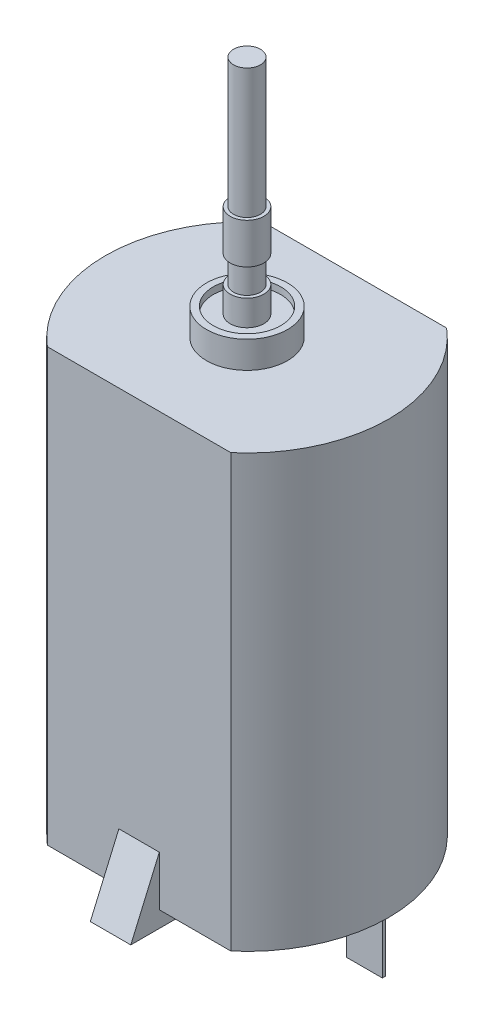
ISO-10303-21;
HEADER;
FILE_DESCRIPTION(('STEP AP214'),'2;1');
FILE_NAME('part.step','',(''),(''),'','','');
FILE_SCHEMA(('AUTOMOTIVE_DESIGN { 1 0 10303 214 1 1 1 1 }'));
ENDSEC;
DATA;
#1=APPLICATION_CONTEXT('core data for automotive mechanical design processes');
#2=APPLICATION_PROTOCOL_DEFINITION('international standard','automotive_design',2000,#1);
#3=PRODUCT_CONTEXT('',#1,'mechanical');
#4=PRODUCT('Part','Part','',(#3));
#5=PRODUCT_RELATED_PRODUCT_CATEGORY('part','',(#4));
#6=PRODUCT_DEFINITION_FORMATION('','',#4);
#7=PRODUCT_DEFINITION_CONTEXT('part definition',#1,'design');
#8=PRODUCT_DEFINITION('design','',#6,#7);
#9=PRODUCT_DEFINITION_SHAPE('','',#8);
#10=(LENGTH_UNIT() NAMED_UNIT(*) SI_UNIT(.MILLI.,.METRE.));
#11=(NAMED_UNIT(*) PLANE_ANGLE_UNIT() SI_UNIT($,.RADIAN.));
#12=(NAMED_UNIT(*) SI_UNIT($,.STERADIAN.) SOLID_ANGLE_UNIT());
#13=UNCERTAINTY_MEASURE_WITH_UNIT(LENGTH_MEASURE(1.E-05),#10,'distance_accuracy_value','');
#14=(GEOMETRIC_REPRESENTATION_CONTEXT(3) GLOBAL_UNCERTAINTY_ASSIGNED_CONTEXT((#13)) GLOBAL_UNIT_ASSIGNED_CONTEXT((#10,
#11,#12)) REPRESENTATION_CONTEXT('',''));
#15=CARTESIAN_POINT('',(0.,0.,0.));
#16=DIRECTION('',(0.,0.,1.));
#17=DIRECTION('',(1.,0.,0.));
#18=AXIS2_PLACEMENT_3D('',#15,#16,#17);
#19=CARTESIAN_POINT('',(1.5,0.,6.55299918127229));
#20=DIRECTION('',(0.,-1.,0.));
#21=DIRECTION('',(0.,0.,-1.));
#22=AXIS2_PLACEMENT_3D('',#19,#20,#21);
#23=PLANE('',#22);
#24=DIRECTION('',(0.,0.,1.));
#25=VECTOR('',#24,1.);
#26=CARTESIAN_POINT('',(-1.5,0.,6.55299918127229));
#27=LINE('',#26,#25);
#28=CARTESIAN_POINT('',(-1.5,0.,6.55299918127229));
#29=VERTEX_POINT('',#28);
#30=CARTESIAN_POINT('',(-1.5,0.,8.));
#31=VERTEX_POINT('',#30);
#32=EDGE_CURVE('E124',#29,#31,#27,.T.);
#33=ORIENTED_EDGE('',*,*,#32,.T.);
#34=DIRECTION('',(-1.,0.,0.));
#35=VECTOR('',#34,1.);
#36=CARTESIAN_POINT('',(1.5,0.,8.));
#37=LINE('',#36,#35);
#38=CARTESIAN_POINT('',(1.5,0.,8.));
#39=VERTEX_POINT('',#38);
#40=EDGE_CURVE('E12',#39,#31,#37,.T.);
#41=ORIENTED_EDGE('',*,*,#40,.F.);
#42=DIRECTION('',(0.,0.,1.));
#43=VECTOR('',#42,1.);
#44=CARTESIAN_POINT('',(1.5,0.,6.55299918127229));
#45=LINE('',#44,#43);
#46=CARTESIAN_POINT('',(1.5,0.,6.55299918127229));
#47=VERTEX_POINT('',#46);
#48=EDGE_CURVE('E132',#47,#39,#45,.T.);
#49=ORIENTED_EDGE('',*,*,#48,.F.);
#50=DIRECTION('',(-1.,0.,0.));
#51=VECTOR('',#50,1.);
#52=CARTESIAN_POINT('',(1.5,0.,6.55299918127229));
#53=LINE('',#52,#51);
#54=EDGE_CURVE('E120',#47,#29,#53,.T.);
#55=ORIENTED_EDGE('',*,*,#54,.T.);
#56=EDGE_LOOP('',(#33,#41,#49,#55));
#57=FACE_BOUND('',#56,.T.);
#58=ADVANCED_FACE('F50',(#57),#23,.F.);
#59=CARTESIAN_POINT('',(1.5,0.,8.));
#60=DIRECTION('',(0.,0.,1.));
#61=DIRECTION('',(1.,0.,0.));
#62=AXIS2_PLACEMENT_3D('',#59,#60,#61);
#63=PLANE('',#62);
#64=DIRECTION('',(0.,1.,0.));
#65=VECTOR('',#64,1.);
#66=CARTESIAN_POINT('',(-1.5,0.,8.));
#67=LINE('',#66,#65);
#68=CARTESIAN_POINT('',(-1.5,3.69723979895403,8.));
#69=VERTEX_POINT('',#68);
#70=EDGE_CURVE('E127',#31,#69,#67,.T.);
#71=ORIENTED_EDGE('',*,*,#70,.T.);
#72=DIRECTION('',(-1.,0.,0.));
#73=VECTOR('',#72,1.);
#74=CARTESIAN_POINT('',(1.5,3.69723979895403,8.));
#75=LINE('',#74,#73);
#76=CARTESIAN_POINT('',(1.5,3.69723979895403,8.));
#77=VERTEX_POINT('',#76);
#78=EDGE_CURVE('E58',#77,#69,#75,.T.);
#79=ORIENTED_EDGE('',*,*,#78,.F.);
#80=DIRECTION('',(0.,1.,0.));
#81=VECTOR('',#80,1.);
#82=CARTESIAN_POINT('',(1.5,0.,8.));
#83=LINE('',#82,#81);
#84=EDGE_CURVE('E100',#39,#77,#83,.T.);
#85=ORIENTED_EDGE('',*,*,#84,.F.);
#86=ORIENTED_EDGE('',*,*,#40,.T.);
#87=EDGE_LOOP('',(#71,#79,#85,#86));
#88=FACE_BOUND('',#87,.T.);
#89=ADVANCED_FACE('F151',(#88),#63,.F.);
#90=CARTESIAN_POINT('',(1.5,3.69723979895403,8.));
#91=DIRECTION('',(0.,-0.396457120748577,-0.918053239963646));
#92=DIRECTION('',(0.,0.918053239963646,-0.396457120748577));
#93=AXIS2_PLACEMENT_3D('',#90,#91,#92);
#94=PLANE('',#93);
#95=DIRECTION('',(0.,-0.918053239963646,0.396457120748577));
#96=VECTOR('',#95,1.);
#97=CARTESIAN_POINT('',(-1.5,3.69723979895403,8.));
#98=LINE('',#97,#96);
#99=CARTESIAN_POINT('',(-1.5,-1.2,10.1148507578771));
#100=VERTEX_POINT('',#99);
#101=EDGE_CURVE('E115',#69,#100,#98,.T.);
#102=ORIENTED_EDGE('',*,*,#101,.T.);
#103=DIRECTION('',(-1.,0.,0.));
#104=VECTOR('',#103,1.);
#105=CARTESIAN_POINT('',(1.5,-1.2,10.1148507578771));
#106=LINE('',#105,#104);
#107=CARTESIAN_POINT('',(1.5,-1.2,10.1148507578771));
#108=VERTEX_POINT('',#107);
#109=EDGE_CURVE('E112',#108,#100,#106,.T.);
#110=ORIENTED_EDGE('',*,*,#109,.F.);
#111=DIRECTION('',(0.,-0.918053239963646,0.396457120748577));
#112=VECTOR('',#111,1.);
#113=CARTESIAN_POINT('',(1.5,3.69723979895403,8.));
#114=LINE('',#113,#112);
#115=EDGE_CURVE('E104',#77,#108,#114,.T.);
#116=ORIENTED_EDGE('',*,*,#115,.F.);
#117=ORIENTED_EDGE('',*,*,#78,.T.);
#118=EDGE_LOOP('',(#102,#110,#116,#117));
#119=FACE_BOUND('',#118,.T.);
#120=ADVANCED_FACE('F113',(#119),#94,.F.);
#121=CARTESIAN_POINT('',(1.5,-1.2,10.1148507578771));
#122=DIRECTION('',(0.,1.,0.));
#123=DIRECTION('',(0.,0.,1.));
#124=AXIS2_PLACEMENT_3D('',#121,#122,#123);
#125=PLANE('',#124);
#126=DIRECTION('',(0.,0.,-1.));
#127=VECTOR('',#126,1.);
#128=CARTESIAN_POINT('',(-1.5,-1.2,10.1148507578771));
#129=LINE('',#128,#127);
#130=CARTESIAN_POINT('',(-1.5,-1.2,6.55299918127229));
#131=VERTEX_POINT('',#130);
#132=EDGE_CURVE('E86',#100,#131,#129,.T.);
#133=ORIENTED_EDGE('',*,*,#132,.T.);
#134=DIRECTION('',(-1.,0.,0.));
#135=VECTOR('',#134,1.);
#136=CARTESIAN_POINT('',(1.5,-1.2,6.55299918127229));
#137=LINE('',#136,#135);
#138=CARTESIAN_POINT('',(1.5,-1.2,6.55299918127229));
#139=VERTEX_POINT('',#138);
#140=EDGE_CURVE('E116',#139,#131,#137,.T.);
#141=ORIENTED_EDGE('',*,*,#140,.F.);
#142=DIRECTION('',(0.,0.,-1.));
#143=VECTOR('',#142,1.);
#144=CARTESIAN_POINT('',(1.5,-1.2,10.1148507578771));
#145=LINE('',#144,#143);
#146=EDGE_CURVE('E108',#108,#139,#145,.T.);
#147=ORIENTED_EDGE('',*,*,#146,.F.);
#148=ORIENTED_EDGE('',*,*,#109,.T.);
#149=EDGE_LOOP('',(#133,#141,#147,#148));
#150=FACE_BOUND('',#149,.T.);
#151=ADVANCED_FACE('F118',(#150),#125,.F.);
#152=CARTESIAN_POINT('',(1.5,-1.2,6.55299918127229));
#153=DIRECTION('',(0.,0.,1.));
#154=DIRECTION('',(1.,0.,0.));
#155=AXIS2_PLACEMENT_3D('',#152,#153,#154);
#156=PLANE('',#155);
#157=DIRECTION('',(0.,1.,0.));
#158=VECTOR('',#157,1.);
#159=CARTESIAN_POINT('',(-1.5,-1.2,6.55299918127229));
#160=LINE('',#159,#158);
#161=EDGE_CURVE('E92',#131,#29,#160,.T.);
#162=ORIENTED_EDGE('',*,*,#161,.T.);
#163=ORIENTED_EDGE('',*,*,#54,.F.);
#164=DIRECTION('',(0.,1.,0.));
#165=VECTOR('',#164,1.);
#166=CARTESIAN_POINT('',(1.5,-1.2,6.55299918127229));
#167=LINE('',#166,#165);
#168=EDGE_CURVE('E66',#139,#47,#167,.T.);
#169=ORIENTED_EDGE('',*,*,#168,.F.);
#170=ORIENTED_EDGE('',*,*,#140,.T.);
#171=EDGE_LOOP('',(#162,#163,#169,#170));
#172=FACE_BOUND('',#171,.T.);
#173=ADVANCED_FACE('F140',(#172),#156,.F.);
#174=CARTESIAN_POINT('',(1.5,0.,0.));
#175=DIRECTION('',(-1.,0.,0.));
#176=DIRECTION('',(0.,0.,1.));
#177=AXIS2_PLACEMENT_3D('',#174,#175,#176);
#178=PLANE('',#177);
#179=ORIENTED_EDGE('',*,*,#48,.T.);
#180=ORIENTED_EDGE('',*,*,#84,.T.);
#181=ORIENTED_EDGE('',*,*,#115,.T.);
#182=ORIENTED_EDGE('',*,*,#146,.T.);
#183=ORIENTED_EDGE('',*,*,#168,.T.);
#184=EDGE_LOOP('',(#179,#180,#181,#182,#183));
#185=FACE_BOUND('',#184,.T.);
#186=ADVANCED_FACE('F106',(#185),#178,.F.);
#187=CARTESIAN_POINT('',(-1.5,0.,0.));
#188=DIRECTION('',(-1.,0.,0.));
#189=DIRECTION('',(0.,0.,1.));
#190=AXIS2_PLACEMENT_3D('',#187,#188,#189);
#191=PLANE('',#190);
#192=ORIENTED_EDGE('',*,*,#32,.F.);
#193=ORIENTED_EDGE('',*,*,#161,.F.);
#194=ORIENTED_EDGE('',*,*,#132,.F.);
#195=ORIENTED_EDGE('',*,*,#101,.F.);
#196=ORIENTED_EDGE('',*,*,#70,.F.);
#197=EDGE_LOOP('',(#192,#193,#194,#195,#196));
#198=FACE_BOUND('',#197,.T.);
#199=ADVANCED_FACE('F136',(#198),#191,.T.);
#200=CLOSED_SHELL('',(#58,#89,#120,#151,#173,#186,#199));
#201=MANIFOLD_SOLID_BREP('B2',#200);
#202=CARTESIAN_POINT('',(1.5,0.,-8.));
#203=DIRECTION('',(0.,0.,-1.));
#204=DIRECTION('',(-1.,0.,0.));
#205=AXIS2_PLACEMENT_3D('',#202,#203,#204);
#206=PLANE('',#205);
#207=DIRECTION('',(0.,-1.,0.));
#208=VECTOR('',#207,1.);
#209=CARTESIAN_POINT('',(-1.5,0.,-8.));
#210=LINE('',#209,#208);
#211=CARTESIAN_POINT('',(-1.5,3.69723979895403,-8.));
#212=VERTEX_POINT('',#211);
#213=CARTESIAN_POINT('',(-1.5,0.,-8.));
#214=VERTEX_POINT('',#213);
#215=EDGE_CURVE('E283',#212,#214,#210,.T.);
#216=ORIENTED_EDGE('',*,*,#215,.T.);
#217=DIRECTION('',(-1.,0.,0.));
#218=VECTOR('',#217,1.);
#219=CARTESIAN_POINT('',(1.5,0.,-8.));
#220=LINE('',#219,#218);
#221=CARTESIAN_POINT('',(1.5,0.,-8.));
#222=VERTEX_POINT('',#221);
#223=EDGE_CURVE('E48',#222,#214,#220,.T.);
#224=ORIENTED_EDGE('',*,*,#223,.F.);
#225=DIRECTION('',(0.,-1.,0.));
#226=VECTOR('',#225,1.);
#227=CARTESIAN_POINT('',(1.5,0.,-8.));
#228=LINE('',#227,#226);
#229=CARTESIAN_POINT('',(1.5,3.69723979895403,-8.));
#230=VERTEX_POINT('',#229);
#231=EDGE_CURVE('E291',#230,#222,#228,.T.);
#232=ORIENTED_EDGE('',*,*,#231,.F.);
#233=DIRECTION('',(-1.,0.,0.));
#234=VECTOR('',#233,1.);
#235=CARTESIAN_POINT('',(1.5,3.69723979895403,-8.));
#236=LINE('',#235,#234);
#237=EDGE_CURVE('E279',#230,#212,#236,.T.);
#238=ORIENTED_EDGE('',*,*,#237,.T.);
#239=EDGE_LOOP('',(#216,#224,#232,#238));
#240=FACE_BOUND('',#239,.T.);
#241=ADVANCED_FACE('F209',(#240),#206,.F.);
#242=CARTESIAN_POINT('',(1.5,0.,-6.55299918127229));
#243=DIRECTION('',(0.,-1.,0.));
#244=DIRECTION('',(0.,0.,-1.));
#245=AXIS2_PLACEMENT_3D('',#242,#243,#244);
#246=PLANE('',#245);
#247=DIRECTION('',(0.,0.,1.));
#248=VECTOR('',#247,1.);
#249=CARTESIAN_POINT('',(-1.5,0.,-6.55299918127229));
#250=LINE('',#249,#248);
#251=CARTESIAN_POINT('',(-1.5,0.,-6.55299918127229));
#252=VERTEX_POINT('',#251);
#253=EDGE_CURVE('E286',#214,#252,#250,.T.);
#254=ORIENTED_EDGE('',*,*,#253,.T.);
#255=DIRECTION('',(-1.,0.,0.));
#256=VECTOR('',#255,1.);
#257=CARTESIAN_POINT('',(1.5,0.,-6.55299918127229));
#258=LINE('',#257,#256);
#259=CARTESIAN_POINT('',(1.5,0.,-6.55299918127229));
#260=VERTEX_POINT('',#259);
#261=EDGE_CURVE('E217',#260,#252,#258,.T.);
#262=ORIENTED_EDGE('',*,*,#261,.F.);
#263=DIRECTION('',(0.,0.,1.));
#264=VECTOR('',#263,1.);
#265=CARTESIAN_POINT('',(1.5,0.,-6.55299918127229));
#266=LINE('',#265,#264);
#267=EDGE_CURVE('E259',#222,#260,#266,.T.);
#268=ORIENTED_EDGE('',*,*,#267,.F.);
#269=ORIENTED_EDGE('',*,*,#223,.T.);
#270=EDGE_LOOP('',(#254,#262,#268,#269));
#271=FACE_BOUND('',#270,.T.);
#272=ADVANCED_FACE('F310',(#271),#246,.F.);
#273=CARTESIAN_POINT('',(1.5,-1.2,-6.55299918127229));
#274=DIRECTION('',(0.,0.,-1.));
#275=DIRECTION('',(-1.,0.,0.));
#276=AXIS2_PLACEMENT_3D('',#273,#274,#275);
#277=PLANE('',#276);
#278=DIRECTION('',(0.,-1.,0.));
#279=VECTOR('',#278,1.);
#280=CARTESIAN_POINT('',(-1.5,-1.2,-6.55299918127229));
#281=LINE('',#280,#279);
#282=CARTESIAN_POINT('',(-1.5,-1.2,-6.55299918127229));
#283=VERTEX_POINT('',#282);
#284=EDGE_CURVE('E274',#252,#283,#281,.T.);
#285=ORIENTED_EDGE('',*,*,#284,.T.);
#286=DIRECTION('',(-1.,0.,0.));
#287=VECTOR('',#286,1.);
#288=CARTESIAN_POINT('',(1.5,-1.2,-6.55299918127229));
#289=LINE('',#288,#287);
#290=CARTESIAN_POINT('',(1.5,-1.2,-6.55299918127229));
#291=VERTEX_POINT('',#290);
#292=EDGE_CURVE('E271',#291,#283,#289,.T.);
#293=ORIENTED_EDGE('',*,*,#292,.F.);
#294=DIRECTION('',(0.,-1.,0.));
#295=VECTOR('',#294,1.);
#296=CARTESIAN_POINT('',(1.5,-1.2,-6.55299918127229));
#297=LINE('',#296,#295);
#298=EDGE_CURVE('E263',#260,#291,#297,.T.);
#299=ORIENTED_EDGE('',*,*,#298,.F.);
#300=ORIENTED_EDGE('',*,*,#261,.T.);
#301=EDGE_LOOP('',(#285,#293,#299,#300));
#302=FACE_BOUND('',#301,.T.);
#303=ADVANCED_FACE('F272',(#302),#277,.F.);
#304=CARTESIAN_POINT('',(1.5,-1.2,-10.1148507578771));
#305=DIRECTION('',(0.,1.,0.));
#306=DIRECTION('',(0.,0.,1.));
#307=AXIS2_PLACEMENT_3D('',#304,#305,#306);
#308=PLANE('',#307);
#309=DIRECTION('',(0.,0.,-1.));
#310=VECTOR('',#309,1.);
#311=CARTESIAN_POINT('',(-1.5,-1.2,-10.1148507578771));
#312=LINE('',#311,#310);
#313=CARTESIAN_POINT('',(-1.5,-1.2,-10.1148507578771));
#314=VERTEX_POINT('',#313);
#315=EDGE_CURVE('E245',#283,#314,#312,.T.);
#316=ORIENTED_EDGE('',*,*,#315,.T.);
#317=DIRECTION('',(-1.,0.,0.));
#318=VECTOR('',#317,1.);
#319=CARTESIAN_POINT('',(1.5,-1.2,-10.1148507578771));
#320=LINE('',#319,#318);
#321=CARTESIAN_POINT('',(1.5,-1.2,-10.1148507578771));
#322=VERTEX_POINT('',#321);
#323=EDGE_CURVE('E275',#322,#314,#320,.T.);
#324=ORIENTED_EDGE('',*,*,#323,.F.);
#325=DIRECTION('',(0.,0.,-1.));
#326=VECTOR('',#325,1.);
#327=CARTESIAN_POINT('',(1.5,-1.2,-10.1148507578771));
#328=LINE('',#327,#326);
#329=EDGE_CURVE('E267',#291,#322,#328,.T.);
#330=ORIENTED_EDGE('',*,*,#329,.F.);
#331=ORIENTED_EDGE('',*,*,#292,.T.);
#332=EDGE_LOOP('',(#316,#324,#330,#331));
#333=FACE_BOUND('',#332,.T.);
#334=ADVANCED_FACE('F277',(#333),#308,.F.);
#335=CARTESIAN_POINT('',(1.5,3.69723979895403,-8.));
#336=DIRECTION('',(0.,-0.396457120748577,0.918053239963646));
#337=DIRECTION('',(0.,-0.918053239963646,-0.396457120748577));
#338=AXIS2_PLACEMENT_3D('',#335,#336,#337);
#339=PLANE('',#338);
#340=DIRECTION('',(0.,0.918053239963646,0.396457120748577));
#341=VECTOR('',#340,1.);
#342=CARTESIAN_POINT('',(-1.5,3.69723979895403,-8.));
#343=LINE('',#342,#341);
#344=EDGE_CURVE('E251',#314,#212,#343,.T.);
#345=ORIENTED_EDGE('',*,*,#344,.T.);
#346=ORIENTED_EDGE('',*,*,#237,.F.);
#347=DIRECTION('',(0.,0.918053239963646,0.396457120748577));
#348=VECTOR('',#347,1.);
#349=CARTESIAN_POINT('',(1.5,3.69723979895403,-8.));
#350=LINE('',#349,#348);
#351=EDGE_CURVE('E225',#322,#230,#350,.T.);
#352=ORIENTED_EDGE('',*,*,#351,.F.);
#353=ORIENTED_EDGE('',*,*,#323,.T.);
#354=EDGE_LOOP('',(#345,#346,#352,#353));
#355=FACE_BOUND('',#354,.T.);
#356=ADVANCED_FACE('F299',(#355),#339,.F.);
#357=CARTESIAN_POINT('',(1.5,0.,0.));
#358=DIRECTION('',(1.,0.,0.));
#359=DIRECTION('',(0.,0.,-1.));
#360=AXIS2_PLACEMENT_3D('',#357,#358,#359);
#361=PLANE('',#360);
#362=ORIENTED_EDGE('',*,*,#231,.T.);
#363=ORIENTED_EDGE('',*,*,#267,.T.);
#364=ORIENTED_EDGE('',*,*,#298,.T.);
#365=ORIENTED_EDGE('',*,*,#329,.T.);
#366=ORIENTED_EDGE('',*,*,#351,.T.);
#367=EDGE_LOOP('',(#362,#363,#364,#365,#366));
#368=FACE_BOUND('',#367,.T.);
#369=ADVANCED_FACE('F265',(#368),#361,.T.);
#370=CARTESIAN_POINT('',(-1.5,0.,0.));
#371=DIRECTION('',(1.,0.,0.));
#372=DIRECTION('',(0.,0.,-1.));
#373=AXIS2_PLACEMENT_3D('',#370,#371,#372);
#374=PLANE('',#373);
#375=ORIENTED_EDGE('',*,*,#215,.F.);
#376=ORIENTED_EDGE('',*,*,#344,.F.);
#377=ORIENTED_EDGE('',*,*,#315,.F.);
#378=ORIENTED_EDGE('',*,*,#284,.F.);
#379=ORIENTED_EDGE('',*,*,#253,.F.);
#380=EDGE_LOOP('',(#375,#376,#377,#378,#379));
#381=FACE_BOUND('',#380,.T.);
#382=ADVANCED_FACE('F295',(#381),#374,.F.);
#383=CLOSED_SHELL('',(#241,#272,#303,#334,#356,#369,#382));
#384=MANIFOLD_SOLID_BREP('B6',#383);
#385=CARTESIAN_POINT('',(0.,50.,0.));
#386=DIRECTION('',(0.,-1.,0.));
#387=DIRECTION('',(0.,0.,-1.));
#388=AXIS2_PLACEMENT_3D('',#385,#386,#387);
#389=CYLINDRICAL_SURFACE('',#388,1.);
#390=CARTESIAN_POINT('',(0.,35.4,0.));
#391=DIRECTION('',(0.,-1.,0.));
#392=DIRECTION('',(1.,0.,0.));
#393=AXIS2_PLACEMENT_3D('',#390,#391,#392);
#394=CIRCLE('',#393,1.);
#395=CARTESIAN_POINT('',(1.,35.4,0.));
#396=VERTEX_POINT('',#395);
#397=EDGE_CURVE('E368',#396,#396,#394,.T.);
#398=ORIENTED_EDGE('',*,*,#397,.F.);
#399=EDGE_LOOP('',(#398));
#400=FACE_BOUND('',#399,.T.);
#401=CARTESIAN_POINT('',(0.,37.4,0.));
#402=DIRECTION('',(0.,1.,0.));
#403=DIRECTION('',(-1.,0.,0.));
#404=AXIS2_PLACEMENT_3D('',#401,#402,#403);
#405=CIRCLE('',#404,1.);
#406=CARTESIAN_POINT('',(-1.,37.4,0.));
#407=VERTEX_POINT('',#406);
#408=EDGE_CURVE('E207',#407,#407,#405,.T.);
#409=ORIENTED_EDGE('',*,*,#408,.F.);
#410=EDGE_LOOP('',(#409));
#411=FACE_BOUND('',#410,.T.);
#412=ADVANCED_FACE('F359',(#400,#411),#389,.T.);
#413=CARTESIAN_POINT('',(0.,0.,0.));
#414=DIRECTION('',(0.,-1.,0.));
#415=DIRECTION('',(0.,0.,-1.));
#416=AXIS2_PLACEMENT_3D('',#413,#414,#415);
#417=PLANE('',#416);
#418=CARTESIAN_POINT('',(0.,0.,0.));
#419=DIRECTION('',(0.,-1.,0.));
#420=DIRECTION('',(0.,0.,-1.));
#421=AXIS2_PLACEMENT_3D('',#418,#419,#420);
#422=CIRCLE('',#421,3.);
#423=CARTESIAN_POINT('',(0.,0.,-3.));
#424=VERTEX_POINT('',#423);
#425=EDGE_CURVE('E545',#424,#424,#422,.T.);
#426=ORIENTED_EDGE('',*,*,#425,.F.);
#427=EDGE_LOOP('',(#426));
#428=FACE_BOUND('',#427,.T.);
#429=CARTESIAN_POINT('',(0.,0.,0.));
#430=DIRECTION('',(0.,-1.,0.));
#431=DIRECTION('',(0.,0.,-1.));
#432=AXIS2_PLACEMENT_3D('',#429,#430,#431);
#433=CIRCLE('',#432,10.5);
#434=CARTESIAN_POINT('',(-6.80073525436772,0.,8.));
#435=VERTEX_POINT('',#434);
#436=CARTESIAN_POINT('',(-6.80073525436772,0.,-8.));
#437=VERTEX_POINT('',#436);
#438=EDGE_CURVE('E567',#435,#437,#433,.T.);
#439=ORIENTED_EDGE('',*,*,#438,.T.);
#440=DIRECTION('',(-1.,0.,0.));
#441=VECTOR('',#440,1.);
#442=CARTESIAN_POINT('',(-10.5,0.,-8.));
#443=LINE('',#442,#441);
#444=CARTESIAN_POINT('',(6.80073525436772,0.,-8.));
#445=VERTEX_POINT('',#444);
#446=EDGE_CURVE('E544',#445,#437,#443,.T.);
#447=ORIENTED_EDGE('',*,*,#446,.F.);
#448=CARTESIAN_POINT('',(0.,0.,0.));
#449=DIRECTION('',(0.,-1.,0.));
#450=DIRECTION('',(0.,0.,-1.));
#451=AXIS2_PLACEMENT_3D('',#448,#449,#450);
#452=CIRCLE('',#451,10.5);
#453=CARTESIAN_POINT('',(6.80073525436772,0.,8.));
#454=VERTEX_POINT('',#453);
#455=EDGE_CURVE('E549',#454,#445,#452,.F.);
#456=ORIENTED_EDGE('',*,*,#455,.F.);
#457=DIRECTION('',(1.,0.,0.));
#458=VECTOR('',#457,1.);
#459=CARTESIAN_POINT('',(-10.5,0.,8.));
#460=LINE('',#459,#458);
#461=EDGE_CURVE('E555',#435,#454,#460,.T.);
#462=ORIENTED_EDGE('',*,*,#461,.F.);
#463=EDGE_LOOP('',(#439,#447,#456,#462));
#464=FACE_BOUND('',#463,.T.);
#465=DIRECTION('',(-1.,0.,0.));
#466=VECTOR('',#465,1.);
#467=CARTESIAN_POINT('',(-10.1462953029439,0.,0.11437047845519));
#468=LINE('',#467,#466);
#469=CARTESIAN_POINT('',(-7.49943565869769,0.,0.11437047845519));
#470=VERTEX_POINT('',#469);
#471=CARTESIAN_POINT('',(-10.1462953029439,0.,0.11437047845519));
#472=VERTEX_POINT('',#471);
#473=EDGE_CURVE('E483',#470,#472,#468,.T.);
#474=ORIENTED_EDGE('',*,*,#473,.F.);
#475=DIRECTION('',(0.,0.,1.));
#476=VECTOR('',#475,1.);
#477=CARTESIAN_POINT('',(-7.49943565869769,0.,-0.11437047845519));
#478=LINE('',#477,#476);
#479=CARTESIAN_POINT('',(-7.49943565869769,0.,-0.11437047845519));
#480=VERTEX_POINT('',#479);
#481=EDGE_CURVE('E478',#480,#470,#478,.T.);
#482=ORIENTED_EDGE('',*,*,#481,.F.);
#483=DIRECTION('',(1.,0.,0.));
#484=VECTOR('',#483,1.);
#485=CARTESIAN_POINT('',(-10.1462953029439,0.,-0.11437047845519));
#486=LINE('',#485,#484);
#487=CARTESIAN_POINT('',(-10.1462953029439,0.,-0.11437047845519));
#488=VERTEX_POINT('',#487);
#489=EDGE_CURVE('E493',#488,#480,#486,.T.);
#490=ORIENTED_EDGE('',*,*,#489,.F.);
#491=DIRECTION('',(0.,0.,-1.));
#492=VECTOR('',#491,1.);
#493=CARTESIAN_POINT('',(-10.1462953029439,0.,-0.11437047845519));
#494=LINE('',#493,#492);
#495=EDGE_CURVE('E505',#472,#488,#494,.T.);
#496=ORIENTED_EDGE('',*,*,#495,.F.);
#497=EDGE_LOOP('',(#474,#482,#490,#496));
#498=FACE_BOUND('',#497,.T.);
#499=DIRECTION('',(-1.,0.,0.));
#500=VECTOR('',#499,1.);
#501=CARTESIAN_POINT('',(10.1462953029439,0.,0.11437047845519));
#502=LINE('',#501,#500);
#503=CARTESIAN_POINT('',(10.1462953029439,0.,0.11437047845519));
#504=VERTEX_POINT('',#503);
#505=CARTESIAN_POINT('',(7.49943565869769,0.,0.11437047845519));
#506=VERTEX_POINT('',#505);
#507=EDGE_CURVE('E594',#504,#506,#502,.T.);
#508=ORIENTED_EDGE('',*,*,#507,.F.);
#509=DIRECTION('',(0.,0.,1.));
#510=VECTOR('',#509,1.);
#511=CARTESIAN_POINT('',(10.1462953029439,0.,-0.11437047845519));
#512=LINE('',#511,#510);
#513=CARTESIAN_POINT('',(10.1462953029439,0.,-0.11437047845519));
#514=VERTEX_POINT('',#513);
#515=EDGE_CURVE('E475',#514,#504,#512,.T.);
#516=ORIENTED_EDGE('',*,*,#515,.F.);
#517=DIRECTION('',(1.,0.,0.));
#518=VECTOR('',#517,1.);
#519=CARTESIAN_POINT('',(10.1462953029439,0.,-0.11437047845519));
#520=LINE('',#519,#518);
#521=CARTESIAN_POINT('',(7.49943565869769,0.,-0.11437047845519));
#522=VERTEX_POINT('',#521);
#523=EDGE_CURVE('E471',#522,#514,#520,.T.);
#524=ORIENTED_EDGE('',*,*,#523,.F.);
#525=DIRECTION('',(0.,0.,-1.));
#526=VECTOR('',#525,1.);
#527=CARTESIAN_POINT('',(7.49943565869769,0.,-0.11437047845519));
#528=LINE('',#527,#526);
#529=EDGE_CURVE('E597',#506,#522,#528,.T.);
#530=ORIENTED_EDGE('',*,*,#529,.F.);
#531=EDGE_LOOP('',(#508,#516,#524,#530));
#532=FACE_BOUND('',#531,.T.);
#533=ADVANCED_FACE('F650',(#428,#464,#498,#532),#417,.T.);
#534=CARTESIAN_POINT('',(0.,32.,0.));
#535=DIRECTION('',(0.,-1.,0.));
#536=DIRECTION('',(0.,0.,-1.));
#537=AXIS2_PLACEMENT_3D('',#534,#535,#536);
#538=PLANE('',#537);
#539=CARTESIAN_POINT('',(0.,32.,0.));
#540=DIRECTION('',(0.,1.,0.));
#541=DIRECTION('',(0.,0.,1.));
#542=AXIS2_PLACEMENT_3D('',#539,#540,#541);
#543=CIRCLE('',#542,3.);
#544=CARTESIAN_POINT('',(0.,32.,3.));
#545=VERTEX_POINT('',#544);
#546=EDGE_CURVE('E573',#545,#545,#543,.T.);
#547=ORIENTED_EDGE('',*,*,#546,.F.);
#548=EDGE_LOOP('',(#547));
#549=FACE_BOUND('',#548,.T.);
#550=DIRECTION('',(-1.,0.,0.));
#551=VECTOR('',#550,1.);
#552=CARTESIAN_POINT('',(-10.5,32.,-8.));
#553=LINE('',#552,#551);
#554=CARTESIAN_POINT('',(6.80073525436772,32.,-8.));
#555=VERTEX_POINT('',#554);
#556=CARTESIAN_POINT('',(-6.80073525436772,32.,-8.));
#557=VERTEX_POINT('',#556);
#558=EDGE_CURVE('E551',#555,#557,#553,.T.);
#559=ORIENTED_EDGE('',*,*,#558,.T.);
#560=CARTESIAN_POINT('',(0.,32.,0.));
#561=DIRECTION('',(0.,1.,0.));
#562=DIRECTION('',(0.,0.,1.));
#563=AXIS2_PLACEMENT_3D('',#560,#561,#562);
#564=CIRCLE('',#563,10.5);
#565=CARTESIAN_POINT('',(-6.80073525436772,32.,8.));
#566=VERTEX_POINT('',#565);
#567=EDGE_CURVE('E527',#557,#566,#564,.T.);
#568=ORIENTED_EDGE('',*,*,#567,.T.);
#569=DIRECTION('',(1.,0.,0.));
#570=VECTOR('',#569,1.);
#571=CARTESIAN_POINT('',(-10.5,32.,8.));
#572=LINE('',#571,#570);
#573=CARTESIAN_POINT('',(6.80073525436772,32.,8.));
#574=VERTEX_POINT('',#573);
#575=EDGE_CURVE('E550',#566,#574,#572,.T.);
#576=ORIENTED_EDGE('',*,*,#575,.T.);
#577=CARTESIAN_POINT('',(0.,32.,0.));
#578=DIRECTION('',(0.,1.,0.));
#579=DIRECTION('',(0.,0.,1.));
#580=AXIS2_PLACEMENT_3D('',#577,#578,#579);
#581=CIRCLE('',#580,10.5);
#582=EDGE_CURVE('E526',#555,#574,#581,.F.);
#583=ORIENTED_EDGE('',*,*,#582,.F.);
#584=EDGE_LOOP('',(#559,#568,#576,#583));
#585=FACE_BOUND('',#584,.T.);
#586=ADVANCED_FACE('F657',(#549,#585),#538,.F.);
#587=CARTESIAN_POINT('',(-10.5,32.,-8.));
#588=DIRECTION('',(0.,0.,1.));
#589=DIRECTION('',(1.,0.,0.));
#590=AXIS2_PLACEMENT_3D('',#587,#588,#589);
#591=PLANE('',#590);
#592=DIRECTION('',(0.,1.,0.));
#593=VECTOR('',#592,1.);
#594=CARTESIAN_POINT('',(-6.80073525436772,-2.,-8.));
#595=LINE('',#594,#593);
#596=EDGE_CURVE('E522',#437,#557,#595,.T.);
#597=ORIENTED_EDGE('',*,*,#596,.T.);
#598=ORIENTED_EDGE('',*,*,#558,.F.);
#599=DIRECTION('',(0.,1.,0.));
#600=VECTOR('',#599,1.);
#601=CARTESIAN_POINT('',(6.80073525436772,-2.,-8.));
#602=LINE('',#601,#600);
#603=EDGE_CURVE('E570',#555,#445,#602,.F.);
#604=ORIENTED_EDGE('',*,*,#603,.T.);
#605=ORIENTED_EDGE('',*,*,#446,.T.);
#606=EDGE_LOOP('',(#597,#598,#604,#605));
#607=FACE_BOUND('',#606,.T.);
#608=ADVANCED_FACE('F361',(#607),#591,.F.);
#609=CARTESIAN_POINT('',(-10.5,32.,8.));
#610=DIRECTION('',(0.,0.,-1.));
#611=DIRECTION('',(-1.,0.,0.));
#612=AXIS2_PLACEMENT_3D('',#609,#610,#611);
#613=PLANE('',#612);
#614=DIRECTION('',(0.,1.,0.));
#615=VECTOR('',#614,1.);
#616=CARTESIAN_POINT('',(-6.80073525436772,-2.,8.));
#617=LINE('',#616,#615);
#618=EDGE_CURVE('E531',#435,#566,#617,.T.);
#619=ORIENTED_EDGE('',*,*,#618,.F.);
#620=ORIENTED_EDGE('',*,*,#461,.T.);
#621=DIRECTION('',(0.,1.,0.));
#622=VECTOR('',#621,1.);
#623=CARTESIAN_POINT('',(6.80073525436772,-2.,8.));
#624=LINE('',#623,#622);
#625=EDGE_CURVE('E532',#454,#574,#624,.T.);
#626=ORIENTED_EDGE('',*,*,#625,.T.);
#627=ORIENTED_EDGE('',*,*,#575,.F.);
#628=EDGE_LOOP('',(#619,#620,#626,#627));
#629=FACE_BOUND('',#628,.T.);
#630=ADVANCED_FACE('F764',(#629),#613,.F.);
#631=CARTESIAN_POINT('',(0.,-2.,0.));
#632=DIRECTION('',(0.,1.,0.));
#633=DIRECTION('',(0.,0.,1.));
#634=AXIS2_PLACEMENT_3D('',#631,#632,#633);
#635=CYLINDRICAL_SURFACE('',#634,3.);
#636=CARTESIAN_POINT('',(0.,-2.,0.));
#637=DIRECTION('',(0.,-1.,0.));
#638=DIRECTION('',(0.,0.,-1.));
#639=AXIS2_PLACEMENT_3D('',#636,#637,#638);
#640=CIRCLE('',#639,3.);
#641=CARTESIAN_POINT('',(0.,-2.,-3.));
#642=VERTEX_POINT('',#641);
#643=EDGE_CURVE('E535',#642,#642,#640,.T.);
#644=ORIENTED_EDGE('',*,*,#643,.F.);
#645=EDGE_LOOP('',(#644));
#646=FACE_BOUND('',#645,.T.);
#647=ORIENTED_EDGE('',*,*,#425,.T.);
#648=EDGE_LOOP('',(#647));
#649=FACE_BOUND('',#648,.T.);
#650=ADVANCED_FACE('F760',(#646,#649),#635,.T.);
#651=CARTESIAN_POINT('',(0.,-2.,0.));
#652=DIRECTION('',(0.,-1.,0.));
#653=DIRECTION('',(0.,0.,-1.));
#654=AXIS2_PLACEMENT_3D('',#651,#652,#653);
#655=PLANE('',#654);
#656=ORIENTED_EDGE('',*,*,#643,.T.);
#657=EDGE_LOOP('',(#656));
#658=FACE_BOUND('',#657,.T.);
#659=ADVANCED_FACE('F756',(#658),#655,.T.);
#660=CARTESIAN_POINT('',(0.,-2.,0.));
#661=DIRECTION('',(0.,1.,0.));
#662=DIRECTION('',(0.,0.,1.));
#663=AXIS2_PLACEMENT_3D('',#660,#661,#662);
#664=CYLINDRICAL_SURFACE('',#663,10.5);
#665=ORIENTED_EDGE('',*,*,#455,.T.);
#666=ORIENTED_EDGE('',*,*,#603,.F.);
#667=ORIENTED_EDGE('',*,*,#582,.T.);
#668=ORIENTED_EDGE('',*,*,#625,.F.);
#669=EDGE_LOOP('',(#665,#666,#667,#668));
#670=FACE_BOUND('',#669,.T.);
#671=ADVANCED_FACE('F752',(#670),#664,.T.);
#672=CARTESIAN_POINT('',(0.,-2.,0.));
#673=DIRECTION('',(0.,1.,0.));
#674=DIRECTION('',(0.,0.,1.));
#675=AXIS2_PLACEMENT_3D('',#672,#673,#674);
#676=CYLINDRICAL_SURFACE('',#675,10.5);
#677=ORIENTED_EDGE('',*,*,#618,.T.);
#678=ORIENTED_EDGE('',*,*,#567,.F.);
#679=ORIENTED_EDGE('',*,*,#596,.F.);
#680=ORIENTED_EDGE('',*,*,#438,.F.);
#681=EDGE_LOOP('',(#677,#678,#679,#680));
#682=FACE_BOUND('',#681,.T.);
#683=ADVANCED_FACE('F748',(#682),#676,.T.);
#684=CARTESIAN_POINT('',(-7.49943565869769,-4.,-0.11437047845519));
#685=DIRECTION('',(-1.,0.,0.));
#686=DIRECTION('',(0.,0.,1.));
#687=AXIS2_PLACEMENT_3D('',#684,#685,#686);
#688=PLANE('',#687);
#689=ORIENTED_EDGE('',*,*,#481,.T.);
#690=DIRECTION('',(0.,1.,0.));
#691=VECTOR('',#690,1.);
#692=CARTESIAN_POINT('',(-7.49943565869769,-4.,0.11437047845519));
#693=LINE('',#692,#691);
#694=CARTESIAN_POINT('',(-7.49943565869769,-4.,0.11437047845519));
#695=VERTEX_POINT('',#694);
#696=EDGE_CURVE('E519',#695,#470,#693,.T.);
#697=ORIENTED_EDGE('',*,*,#696,.F.);
#698=DIRECTION('',(0.,0.,1.));
#699=VECTOR('',#698,1.);
#700=CARTESIAN_POINT('',(-7.49943565869769,-4.,-0.11437047845519));
#701=LINE('',#700,#699);
#702=CARTESIAN_POINT('',(-7.49943565869769,-4.,-0.11437047845519));
#703=VERTEX_POINT('',#702);
#704=EDGE_CURVE('E488',#703,#695,#701,.T.);
#705=ORIENTED_EDGE('',*,*,#704,.F.);
#706=DIRECTION('',(0.,1.,0.));
#707=VECTOR('',#706,1.);
#708=CARTESIAN_POINT('',(-7.49943565869769,-4.,-0.11437047845519));
#709=LINE('',#708,#707);
#710=EDGE_CURVE('E501',#703,#480,#709,.T.);
#711=ORIENTED_EDGE('',*,*,#710,.T.);
#712=EDGE_LOOP('',(#689,#697,#705,#711));
#713=FACE_BOUND('',#712,.T.);
#714=ADVANCED_FACE('F744',(#713),#688,.F.);
#715=CARTESIAN_POINT('',(-10.1462953029439,-4.,0.11437047845519));
#716=DIRECTION('',(0.,0.,-1.));
#717=DIRECTION('',(-1.,0.,0.));
#718=AXIS2_PLACEMENT_3D('',#715,#716,#717);
#719=PLANE('',#718);
#720=ORIENTED_EDGE('',*,*,#473,.T.);
#721=DIRECTION('',(0.,1.,0.));
#722=VECTOR('',#721,1.);
#723=CARTESIAN_POINT('',(-10.1462953029439,-4.,0.11437047845519));
#724=LINE('',#723,#722);
#725=CARTESIAN_POINT('',(-10.1462953029439,-4.,0.11437047845519));
#726=VERTEX_POINT('',#725);
#727=EDGE_CURVE('E515',#726,#472,#724,.T.);
#728=ORIENTED_EDGE('',*,*,#727,.F.);
#729=DIRECTION('',(-1.,0.,0.));
#730=VECTOR('',#729,1.);
#731=CARTESIAN_POINT('',(-10.1462953029439,-4.,0.11437047845519));
#732=LINE('',#731,#730);
#733=EDGE_CURVE('E492',#695,#726,#732,.T.);
#734=ORIENTED_EDGE('',*,*,#733,.F.);
#735=ORIENTED_EDGE('',*,*,#696,.T.);
#736=EDGE_LOOP('',(#720,#728,#734,#735));
#737=FACE_BOUND('',#736,.T.);
#738=ADVANCED_FACE('F740',(#737),#719,.F.);
#739=CARTESIAN_POINT('',(-10.1462953029439,-4.,-0.11437047845519));
#740=DIRECTION('',(1.,0.,0.));
#741=DIRECTION('',(0.,0.,-1.));
#742=AXIS2_PLACEMENT_3D('',#739,#740,#741);
#743=PLANE('',#742);
#744=ORIENTED_EDGE('',*,*,#495,.T.);
#745=DIRECTION('',(0.,1.,0.));
#746=VECTOR('',#745,1.);
#747=CARTESIAN_POINT('',(-10.1462953029439,-4.,-0.11437047845519));
#748=LINE('',#747,#746);
#749=CARTESIAN_POINT('',(-10.1462953029439,-4.,-0.11437047845519));
#750=VERTEX_POINT('',#749);
#751=EDGE_CURVE('E383',#750,#488,#748,.T.);
#752=ORIENTED_EDGE('',*,*,#751,.F.);
#753=DIRECTION('',(0.,0.,-1.));
#754=VECTOR('',#753,1.);
#755=CARTESIAN_POINT('',(-10.1462953029439,-4.,-0.11437047845519));
#756=LINE('',#755,#754);
#757=EDGE_CURVE('E496',#726,#750,#756,.T.);
#758=ORIENTED_EDGE('',*,*,#757,.F.);
#759=ORIENTED_EDGE('',*,*,#727,.T.);
#760=EDGE_LOOP('',(#744,#752,#758,#759));
#761=FACE_BOUND('',#760,.T.);
#762=ADVANCED_FACE('F737',(#761),#743,.F.);
#763=CARTESIAN_POINT('',(-10.1462953029439,-4.,-0.11437047845519));
#764=DIRECTION('',(0.,0.,1.));
#765=DIRECTION('',(1.,0.,0.));
#766=AXIS2_PLACEMENT_3D('',#763,#764,#765);
#767=PLANE('',#766);
#768=ORIENTED_EDGE('',*,*,#489,.T.);
#769=ORIENTED_EDGE('',*,*,#710,.F.);
#770=DIRECTION('',(1.,0.,0.));
#771=VECTOR('',#770,1.);
#772=CARTESIAN_POINT('',(-10.1462953029439,-4.,-0.11437047845519));
#773=LINE('',#772,#771);
#774=EDGE_CURVE('E499',#750,#703,#773,.T.);
#775=ORIENTED_EDGE('',*,*,#774,.F.);
#776=ORIENTED_EDGE('',*,*,#751,.T.);
#777=EDGE_LOOP('',(#768,#769,#775,#776));
#778=FACE_BOUND('',#777,.T.);
#779=ADVANCED_FACE('F733',(#778),#767,.F.);
#780=CARTESIAN_POINT('',(0.,-4.,0.));
#781=DIRECTION('',(0.,1.,0.));
#782=DIRECTION('',(0.,0.,1.));
#783=AXIS2_PLACEMENT_3D('',#780,#781,#782);
#784=PLANE('',#783);
#785=ORIENTED_EDGE('',*,*,#704,.T.);
#786=ORIENTED_EDGE('',*,*,#733,.T.);
#787=ORIENTED_EDGE('',*,*,#757,.T.);
#788=ORIENTED_EDGE('',*,*,#774,.T.);
#789=EDGE_LOOP('',(#785,#786,#787,#788));
#790=FACE_BOUND('',#789,.T.);
#791=ADVANCED_FACE('F730',(#790),#784,.F.);
#792=CARTESIAN_POINT('',(10.1462953029439,-4.,-0.11437047845519));
#793=DIRECTION('',(-1.,0.,0.));
#794=DIRECTION('',(0.,0.,1.));
#795=AXIS2_PLACEMENT_3D('',#792,#793,#794);
#796=PLANE('',#795);
#797=ORIENTED_EDGE('',*,*,#515,.T.);
#798=DIRECTION('',(0.,1.,0.));
#799=VECTOR('',#798,1.);
#800=CARTESIAN_POINT('',(10.1462953029439,-4.,0.11437047845519));
#801=LINE('',#800,#799);
#802=CARTESIAN_POINT('',(10.1462953029439,-4.,0.11437047845519));
#803=VERTEX_POINT('',#802);
#804=EDGE_CURVE('E454',#803,#504,#801,.T.);
#805=ORIENTED_EDGE('',*,*,#804,.F.);
#806=DIRECTION('',(0.,0.,1.));
#807=VECTOR('',#806,1.);
#808=CARTESIAN_POINT('',(10.1462953029439,-4.,-0.11437047845519));
#809=LINE('',#808,#807);
#810=CARTESIAN_POINT('',(10.1462953029439,-4.,-0.11437047845519));
#811=VERTEX_POINT('',#810);
#812=EDGE_CURVE('E462',#811,#803,#809,.T.);
#813=ORIENTED_EDGE('',*,*,#812,.F.);
#814=DIRECTION('',(0.,1.,0.));
#815=VECTOR('',#814,1.);
#816=CARTESIAN_POINT('',(10.1462953029439,-4.,-0.11437047845519));
#817=LINE('',#816,#815);
#818=EDGE_CURVE('E591',#811,#514,#817,.T.);
#819=ORIENTED_EDGE('',*,*,#818,.T.);
#820=EDGE_LOOP('',(#797,#805,#813,#819));
#821=FACE_BOUND('',#820,.T.);
#822=ADVANCED_FACE('F473',(#821),#796,.F.);
#823=CARTESIAN_POINT('',(10.1462953029439,-4.,0.11437047845519));
#824=DIRECTION('',(0.,0.,-1.));
#825=DIRECTION('',(-1.,0.,0.));
#826=AXIS2_PLACEMENT_3D('',#823,#824,#825);
#827=PLANE('',#826);
#828=ORIENTED_EDGE('',*,*,#507,.T.);
#829=DIRECTION('',(0.,1.,0.));
#830=VECTOR('',#829,1.);
#831=CARTESIAN_POINT('',(7.49943565869769,-4.,0.11437047845519));
#832=LINE('',#831,#830);
#833=CARTESIAN_POINT('',(7.49943565869769,-4.,0.11437047845519));
#834=VERTEX_POINT('',#833);
#835=EDGE_CURVE('E457',#834,#506,#832,.T.);
#836=ORIENTED_EDGE('',*,*,#835,.F.);
#837=DIRECTION('',(-1.,0.,0.));
#838=VECTOR('',#837,1.);
#839=CARTESIAN_POINT('',(10.1462953029439,-4.,0.11437047845519));
#840=LINE('',#839,#838);
#841=EDGE_CURVE('E450',#803,#834,#840,.T.);
#842=ORIENTED_EDGE('',*,*,#841,.F.);
#843=ORIENTED_EDGE('',*,*,#804,.T.);
#844=EDGE_LOOP('',(#828,#836,#842,#843));
#845=FACE_BOUND('',#844,.T.);
#846=ADVANCED_FACE('F452',(#845),#827,.F.);
#847=CARTESIAN_POINT('',(7.49943565869769,-4.,-0.11437047845519));
#848=DIRECTION('',(1.,0.,0.));
#849=DIRECTION('',(0.,0.,-1.));
#850=AXIS2_PLACEMENT_3D('',#847,#848,#849);
#851=PLANE('',#850);
#852=ORIENTED_EDGE('',*,*,#529,.T.);
#853=DIRECTION('',(0.,1.,0.));
#854=VECTOR('',#853,1.);
#855=CARTESIAN_POINT('',(7.49943565869769,-4.,-0.11437047845519));
#856=LINE('',#855,#854);
#857=CARTESIAN_POINT('',(7.49943565869769,-4.,-0.11437047845519));
#858=VERTEX_POINT('',#857);
#859=EDGE_CURVE('E375',#858,#522,#856,.T.);
#860=ORIENTED_EDGE('',*,*,#859,.F.);
#861=DIRECTION('',(0.,0.,-1.));
#862=VECTOR('',#861,1.);
#863=CARTESIAN_POINT('',(7.49943565869769,-4.,-0.11437047845519));
#864=LINE('',#863,#862);
#865=EDGE_CURVE('E461',#834,#858,#864,.T.);
#866=ORIENTED_EDGE('',*,*,#865,.F.);
#867=ORIENTED_EDGE('',*,*,#835,.T.);
#868=EDGE_LOOP('',(#852,#860,#866,#867));
#869=FACE_BOUND('',#868,.T.);
#870=ADVANCED_FACE('F722',(#869),#851,.F.);
#871=CARTESIAN_POINT('',(10.1462953029439,-4.,-0.11437047845519));
#872=DIRECTION('',(0.,0.,1.));
#873=DIRECTION('',(1.,0.,0.));
#874=AXIS2_PLACEMENT_3D('',#871,#872,#873);
#875=PLANE('',#874);
#876=ORIENTED_EDGE('',*,*,#523,.T.);
#877=ORIENTED_EDGE('',*,*,#818,.F.);
#878=DIRECTION('',(1.,0.,0.));
#879=VECTOR('',#878,1.);
#880=CARTESIAN_POINT('',(10.1462953029439,-4.,-0.11437047845519));
#881=LINE('',#880,#879);
#882=EDGE_CURVE('E466',#858,#811,#881,.T.);
#883=ORIENTED_EDGE('',*,*,#882,.F.);
#884=ORIENTED_EDGE('',*,*,#859,.T.);
#885=EDGE_LOOP('',(#876,#877,#883,#884));
#886=FACE_BOUND('',#885,.T.);
#887=ADVANCED_FACE('F717',(#886),#875,.F.);
#888=CARTESIAN_POINT('',(0.,-4.,0.));
#889=DIRECTION('',(0.,-1.,0.));
#890=DIRECTION('',(0.,0.,-1.));
#891=AXIS2_PLACEMENT_3D('',#888,#889,#890);
#892=PLANE('',#891);
#893=ORIENTED_EDGE('',*,*,#812,.T.);
#894=ORIENTED_EDGE('',*,*,#841,.T.);
#895=ORIENTED_EDGE('',*,*,#865,.T.);
#896=ORIENTED_EDGE('',*,*,#882,.T.);
#897=EDGE_LOOP('',(#893,#894,#895,#896));
#898=FACE_BOUND('',#897,.T.);
#899=ADVANCED_FACE('F465',(#898),#892,.T.);
#900=CARTESIAN_POINT('',(0.,34.,0.));
#901=DIRECTION('',(0.,-1.,0.));
#902=DIRECTION('',(0.,0.,-1.));
#903=AXIS2_PLACEMENT_3D('',#900,#901,#902);
#904=CYLINDRICAL_SURFACE('',#903,3.);
#905=CARTESIAN_POINT('',(0.,34.,0.));
#906=DIRECTION('',(0.,1.,0.));
#907=DIRECTION('',(0.,0.,1.));
#908=AXIS2_PLACEMENT_3D('',#905,#906,#907);
#909=CIRCLE('',#908,3.);
#910=CARTESIAN_POINT('',(0.,34.,3.));
#911=VERTEX_POINT('',#910);
#912=EDGE_CURVE('E584',#911,#911,#909,.T.);
#913=ORIENTED_EDGE('',*,*,#912,.F.);
#914=EDGE_LOOP('',(#913));
#915=FACE_BOUND('',#914,.T.);
#916=ORIENTED_EDGE('',*,*,#546,.T.);
#917=EDGE_LOOP('',(#916));
#918=FACE_BOUND('',#917,.T.);
#919=ADVANCED_FACE('F708',(#915,#918),#904,.T.);
#920=CARTESIAN_POINT('',(0.,34.,0.));
#921=DIRECTION('',(0.,1.,0.));
#922=DIRECTION('',(0.,0.,1.));
#923=AXIS2_PLACEMENT_3D('',#920,#921,#922);
#924=PLANE('',#923);
#925=CARTESIAN_POINT('',(0.,34.,0.));
#926=DIRECTION('',(0.,1.,0.));
#927=DIRECTION('',(0.,0.,1.));
#928=AXIS2_PLACEMENT_3D('',#925,#926,#927);
#929=CIRCLE('',#928,2.5);
#930=CARTESIAN_POINT('',(0.,34.,2.5));
#931=VERTEX_POINT('',#930);
#932=EDGE_CURVE('E610',#931,#931,#929,.T.);
#933=ORIENTED_EDGE('',*,*,#932,.F.);
#934=EDGE_LOOP('',(#933));
#935=FACE_BOUND('',#934,.T.);
#936=ORIENTED_EDGE('',*,*,#912,.T.);
#937=EDGE_LOOP('',(#936));
#938=FACE_BOUND('',#937,.T.);
#939=ADVANCED_FACE('F702',(#935,#938),#924,.T.);
#940=CARTESIAN_POINT('',(0.,33.5,0.));
#941=DIRECTION('',(0.,1.,0.));
#942=DIRECTION('',(0.,0.,1.));
#943=AXIS2_PLACEMENT_3D('',#940,#941,#942);
#944=CYLINDRICAL_SURFACE('',#943,2.5);
#945=CARTESIAN_POINT('',(0.,33.5,0.));
#946=DIRECTION('',(0.,1.,0.));
#947=DIRECTION('',(0.,0.,1.));
#948=AXIS2_PLACEMENT_3D('',#945,#946,#947);
#949=CIRCLE('',#948,2.5);
#950=CARTESIAN_POINT('',(0.,33.5,2.5));
#951=VERTEX_POINT('',#950);
#952=EDGE_CURVE('E607',#951,#951,#949,.T.);
#953=ORIENTED_EDGE('',*,*,#952,.F.);
#954=EDGE_LOOP('',(#953));
#955=FACE_BOUND('',#954,.T.);
#956=ORIENTED_EDGE('',*,*,#932,.T.);
#957=EDGE_LOOP('',(#956));
#958=FACE_BOUND('',#957,.T.);
#959=ADVANCED_FACE('F692',(#955,#958),#944,.F.);
#960=CARTESIAN_POINT('',(0.,33.5,0.));
#961=DIRECTION('',(0.,1.,0.));
#962=DIRECTION('',(0.,0.,1.));
#963=AXIS2_PLACEMENT_3D('',#960,#961,#962);
#964=PLANE('',#963);
#965=CARTESIAN_POINT('',(0.,33.5,-1.60288449180257E-12));
#966=DIRECTION('',(0.,1.,0.));
#967=DIRECTION('',(0.,0.,1.));
#968=AXIS2_PLACEMENT_3D('',#965,#966,#967);
#969=CIRCLE('',#968,1.25);
#970=CARTESIAN_POINT('',(0.,33.5,1.2499999999984));
#971=VERTEX_POINT('',#970);
#972=EDGE_CURVE('E621',#971,#971,#969,.T.);
#973=ORIENTED_EDGE('',*,*,#972,.F.);
#974=EDGE_LOOP('',(#973));
#975=FACE_BOUND('',#974,.T.);
#976=ORIENTED_EDGE('',*,*,#952,.T.);
#977=EDGE_LOOP('',(#976));
#978=FACE_BOUND('',#977,.T.);
#979=ADVANCED_FACE('F687',(#975,#978),#964,.T.);
#980=CARTESIAN_POINT('',(0.,38.9355339059327,-1.59835236085506E-12));
#981=DIRECTION('',(0.,-1.,0.));
#982=DIRECTION('',(1.,0.,0.));
#983=AXIS2_PLACEMENT_3D('',#980,#981,#982);
#984=CYLINDRICAL_SURFACE('',#983,1.25);
#985=CARTESIAN_POINT('',(0.,35.4,-1.60130027782299E-12));
#986=DIRECTION('',(0.,-1.,0.));
#987=DIRECTION('',(1.,0.,0.));
#988=AXIS2_PLACEMENT_3D('',#985,#986,#987);
#989=CIRCLE('',#988,1.25);
#990=CARTESIAN_POINT('',(1.25,35.4,-1.60130027782299E-12));
#991=VERTEX_POINT('',#990);
#992=EDGE_CURVE('E617',#991,#991,#989,.T.);
#993=ORIENTED_EDGE('',*,*,#992,.T.);
#994=EDGE_LOOP('',(#993));
#995=FACE_BOUND('',#994,.T.);
#996=ORIENTED_EDGE('',*,*,#972,.T.);
#997=EDGE_LOOP('',(#996));
#998=FACE_BOUND('',#997,.T.);
#999=ADVANCED_FACE('F683',(#995,#998),#984,.T.);
#1000=CARTESIAN_POINT('',(4.52501393484994E-13,35.4,6.88752349776051E-13));
#1001=DIRECTION('',(0.,-1.,0.));
#1002=DIRECTION('',(0.954894620492205,0.,0.296944883362295));
#1003=AXIS2_PLACEMENT_3D('',#1000,#1001,#1002);
#1004=PLANE('',#1003);
#1005=ORIENTED_EDGE('',*,*,#397,.T.);
#1006=EDGE_LOOP('',(#1005));
#1007=FACE_BOUND('',#1006,.T.);
#1008=ORIENTED_EDGE('',*,*,#992,.F.);
#1009=EDGE_LOOP('',(#1008));
#1010=FACE_BOUND('',#1009,.T.);
#1011=ADVANCED_FACE('F678',(#1007,#1010),#1004,.F.);
#1012=CARTESIAN_POINT('',(0.,43.935533905936,0.));
#1013=DIRECTION('',(0.,-1.,0.));
#1014=DIRECTION('',(1.,0.,0.));
#1015=AXIS2_PLACEMENT_3D('',#1012,#1013,#1014);
#1016=CYLINDRICAL_SURFACE('',#1015,1.2500000000012);
#1017=CARTESIAN_POINT('',(0.,37.4,0.));
#1018=DIRECTION('',(0.,1.,0.));
#1019=DIRECTION('',(-1.,0.,0.));
#1020=AXIS2_PLACEMENT_3D('',#1017,#1018,#1019);
#1021=CIRCLE('',#1020,1.2500000000012);
#1022=CARTESIAN_POINT('',(-1.25000000000121,37.4,0.));
#1023=VERTEX_POINT('',#1022);
#1024=EDGE_CURVE('E633',#1023,#1023,#1021,.T.);
#1025=ORIENTED_EDGE('',*,*,#1024,.T.);
#1026=EDGE_LOOP('',(#1025));
#1027=FACE_BOUND('',#1026,.T.);
#1028=CARTESIAN_POINT('',(0.,40.3999999999999,0.));
#1029=DIRECTION('',(0.,1.,0.));
#1030=DIRECTION('',(-1.,0.,0.));
#1031=AXIS2_PLACEMENT_3D('',#1028,#1029,#1030);
#1032=CIRCLE('',#1031,1.2500000000012);
#1033=CARTESIAN_POINT('',(-1.25000000000121,40.3999999999999,0.));
#1034=VERTEX_POINT('',#1033);
#1035=EDGE_CURVE('E625',#1034,#1034,#1032,.T.);
#1036=ORIENTED_EDGE('',*,*,#1035,.F.);
#1037=EDGE_LOOP('',(#1036));
#1038=FACE_BOUND('',#1037,.T.);
#1039=ADVANCED_FACE('F639',(#1027,#1038),#1016,.T.);
#1040=CARTESIAN_POINT('',(0.,37.4,0.));
#1041=DIRECTION('',(0.,1.,0.));
#1042=DIRECTION('',(-1.,0.,0.));
#1043=AXIS2_PLACEMENT_3D('',#1040,#1041,#1042);
#1044=PLANE('',#1043);
#1045=ORIENTED_EDGE('',*,*,#1024,.F.);
#1046=EDGE_LOOP('',(#1045));
#1047=FACE_BOUND('',#1046,.T.);
#1048=ORIENTED_EDGE('',*,*,#408,.T.);
#1049=EDGE_LOOP('',(#1048));
#1050=FACE_BOUND('',#1049,.T.);
#1051=ADVANCED_FACE('F642',(#1047,#1050),#1044,.F.);
#1052=CARTESIAN_POINT('',(0.,40.3999999999999,0.));
#1053=DIRECTION('',(0.,1.,0.));
#1054=DIRECTION('',(0.229130820705892,0.,0.973395637447921));
#1055=AXIS2_PLACEMENT_3D('',#1052,#1053,#1054);
#1056=PLANE('',#1055);
#1057=CARTESIAN_POINT('',(0.,40.3999999999999,0.));
#1058=DIRECTION('',(0.,1.,0.));
#1059=DIRECTION('',(0.229130820705892,0.,0.973395637447921));
#1060=AXIS2_PLACEMENT_3D('',#1057,#1058,#1059);
#1061=CIRCLE('',#1060,1.);
#1062=CARTESIAN_POINT('',(0.229130820705892,40.3999999999999,0.973395637447917));
#1063=VERTEX_POINT('',#1062);
#1064=EDGE_CURVE('E629',#1063,#1063,#1061,.T.);
#1065=ORIENTED_EDGE('',*,*,#1064,.F.);
#1066=EDGE_LOOP('',(#1065));
#1067=FACE_BOUND('',#1066,.T.);
#1068=ORIENTED_EDGE('',*,*,#1035,.T.);
#1069=EDGE_LOOP('',(#1068));
#1070=FACE_BOUND('',#1069,.T.);
#1071=ADVANCED_FACE('F645',(#1067,#1070),#1056,.T.);
#1072=CARTESIAN_POINT('',(0.,50.,0.));
#1073=DIRECTION('',(0.,1.,0.));
#1074=DIRECTION('',(0.,0.,1.));
#1075=AXIS2_PLACEMENT_3D('',#1072,#1073,#1074);
#1076=PLANE('',#1075);
#1077=CARTESIAN_POINT('',(0.,50.,0.));
#1078=DIRECTION('',(0.,1.,0.));
#1079=DIRECTION('',(0.,0.,1.));
#1080=AXIS2_PLACEMENT_3D('',#1077,#1078,#1079);
#1081=CIRCLE('',#1080,1.);
#1082=CARTESIAN_POINT('',(0.,50.,1.));
#1083=VERTEX_POINT('',#1082);
#1084=EDGE_CURVE('E614',#1083,#1083,#1081,.T.);
#1085=ORIENTED_EDGE('',*,*,#1084,.T.);
#1086=EDGE_LOOP('',(#1085));
#1087=FACE_BOUND('',#1086,.T.);
#1088=ADVANCED_FACE('F663',(#1087),#1076,.T.);
#1089=ORIENTED_EDGE('',*,*,#1064,.T.);
#1090=EDGE_LOOP('',(#1089));
#1091=FACE_BOUND('',#1090,.T.);
#1092=ORIENTED_EDGE('',*,*,#1084,.F.);
#1093=EDGE_LOOP('',(#1092));
#1094=FACE_BOUND('',#1093,.T.);
#1095=ADVANCED_FACE('F653',(#1091,#1094),#389,.T.);
#1096=CLOSED_SHELL('',(#412,#533,#586,#608,#630,#650,#659,#671,#683,#714,#738,#762,#779,#791,
#822,#846,#870,#887,#899,#919,#939,#959,#979,#999,#1011,#1039,#1051,#1071,#1088,#1095));
#1097=MANIFOLD_SOLID_BREP('B42',#1096);
#1098=ADVANCED_BREP_SHAPE_REPRESENTATION('',(#18,#201,#384,#1097),#14);
#1099=SHAPE_DEFINITION_REPRESENTATION(#9,#1098);
ENDSEC;
END-ISO-10303-21;
